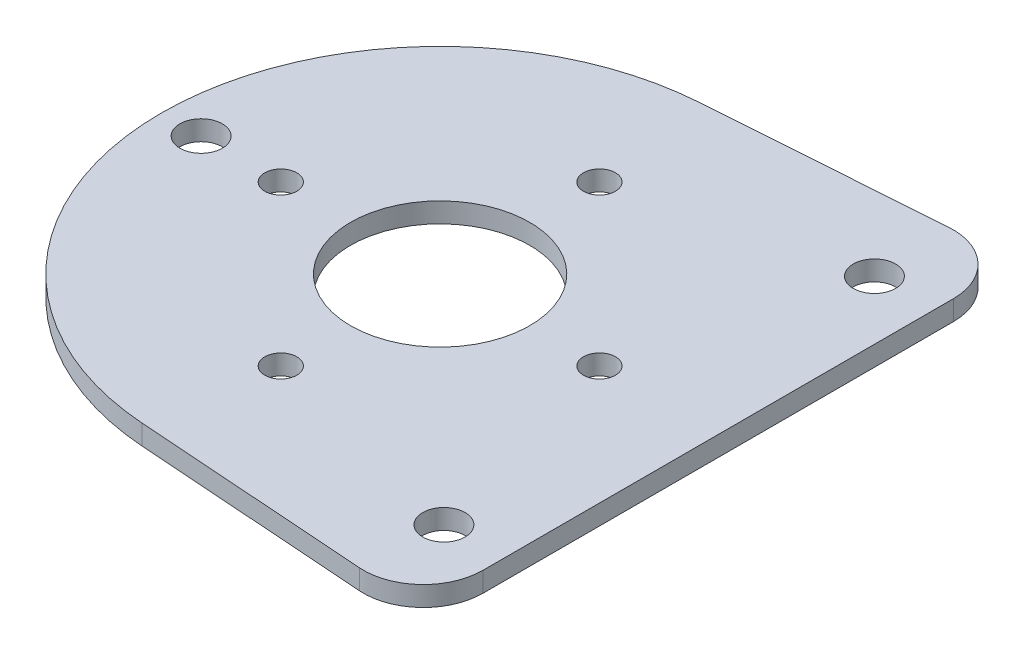
ISO-10303-21;
HEADER;
FILE_DESCRIPTION(('STEP AP214'),'2;1');
FILE_NAME('part.step','',(''),(''),'','','');
FILE_SCHEMA(('AUTOMOTIVE_DESIGN { 1 0 10303 214 1 1 1 1 }'));
ENDSEC;
DATA;
#1=APPLICATION_CONTEXT('core data for automotive mechanical design processes');
#2=APPLICATION_PROTOCOL_DEFINITION('international standard','automotive_design',2000,#1);
#3=PRODUCT_CONTEXT('',#1,'mechanical');
#4=PRODUCT('Part','Part','',(#3));
#5=PRODUCT_RELATED_PRODUCT_CATEGORY('part','',(#4));
#6=PRODUCT_DEFINITION_FORMATION('','',#4);
#7=PRODUCT_DEFINITION_CONTEXT('part definition',#1,'design');
#8=PRODUCT_DEFINITION('design','',#6,#7);
#9=PRODUCT_DEFINITION_SHAPE('','',#8);
#10=(LENGTH_UNIT() NAMED_UNIT(*) SI_UNIT(.MILLI.,.METRE.));
#11=(NAMED_UNIT(*) PLANE_ANGLE_UNIT() SI_UNIT($,.RADIAN.));
#12=(NAMED_UNIT(*) SI_UNIT($,.STERADIAN.) SOLID_ANGLE_UNIT());
#13=UNCERTAINTY_MEASURE_WITH_UNIT(LENGTH_MEASURE(1.E-05),#10,'distance_accuracy_value','');
#14=(GEOMETRIC_REPRESENTATION_CONTEXT(3) GLOBAL_UNCERTAINTY_ASSIGNED_CONTEXT((#13)) GLOBAL_UNIT_ASSIGNED_CONTEXT((#10,
#11,#12)) REPRESENTATION_CONTEXT('',''));
#15=CARTESIAN_POINT('',(0.,0.,0.));
#16=DIRECTION('',(0.,0.,1.));
#17=DIRECTION('',(1.,0.,0.));
#18=AXIS2_PLACEMENT_3D('',#15,#16,#17);
#19=CARTESIAN_POINT('',(89.48928,0.,0.));
#20=DIRECTION('',(0.,-1.,0.));
#21=DIRECTION('',(0.,0.,-1.));
#22=AXIS2_PLACEMENT_3D('',#19,#20,#21);
#23=PLANE('',#22);
#24=DIRECTION('',(-0.997479288528233,0.,0.0709582198001818));
#25=VECTOR('',#24,1.);
#26=CARTESIAN_POINT('',(85.8846024341508,0.,-50.6719478572342));
#27=LINE('',#26,#25);
#28=CARTESIAN_POINT('',(34.1221229564032,0.,-46.9896925578747));
#29=VERTEX_POINT('',#28);
#30=CARTESIAN_POINT('',(-3.15409287011808,0.,-44.3379543750799));
#31=VERTEX_POINT('',#30);
#32=EDGE_CURVE('E104',#29,#31,#27,.T.);
#33=ORIENTED_EDGE('',*,*,#32,.F.);
#34=CARTESIAN_POINT('',(34.798,0.,-37.4887023346433));
#35=DIRECTION('',(0.,-1.,0.));
#36=DIRECTION('',(0.,0.,-1.));
#37=AXIS2_PLACEMENT_3D('',#34,#35,#36);
#38=CIRCLE('',#37,9.525);
#39=CARTESIAN_POINT('',(44.323,0.,-37.4887023346433));
#40=VERTEX_POINT('',#39);
#41=EDGE_CURVE('E43',#29,#40,#38,.T.);
#42=ORIENTED_EDGE('',*,*,#41,.T.);
#43=DIRECTION('',(0.,0.,1.));
#44=VECTOR('',#43,1.);
#45=CARTESIAN_POINT('',(44.323,0.,47.7153578260551));
#46=LINE('',#45,#44);
#47=CARTESIAN_POINT('',(44.323,0.,37.4887023346433));
#48=VERTEX_POINT('',#47);
#49=EDGE_CURVE('E135',#40,#48,#46,.T.);
#50=ORIENTED_EDGE('',*,*,#49,.T.);
#51=CARTESIAN_POINT('',(34.798,0.,37.4887023346433));
#52=DIRECTION('',(0.,-1.,0.));
#53=DIRECTION('',(0.,0.,-1.));
#54=AXIS2_PLACEMENT_3D('',#51,#52,#53);
#55=CIRCLE('',#54,9.525);
#56=CARTESIAN_POINT('',(34.1221229564032,0.,46.9896925578747));
#57=VERTEX_POINT('',#56);
#58=EDGE_CURVE('E50',#48,#57,#55,.T.);
#59=ORIENTED_EDGE('',*,*,#58,.T.);
#60=DIRECTION('',(0.997479288528233,0.,0.0709582198001818));
#61=VECTOR('',#60,1.);
#62=CARTESIAN_POINT('',(85.8846024341508,0.,50.6719478572342));
#63=LINE('',#62,#61);
#64=CARTESIAN_POINT('',(-3.15409287011808,0.,44.3379543750799));
#65=VERTEX_POINT('',#64);
#66=EDGE_CURVE('E99',#65,#57,#63,.T.);
#67=ORIENTED_EDGE('',*,*,#66,.F.);
#68=CARTESIAN_POINT('',(0.,0.,0.));
#69=DIRECTION('',(0.,1.,0.));
#70=DIRECTION('',(0.,0.,1.));
#71=AXIS2_PLACEMENT_3D('',#68,#69,#70);
#72=CIRCLE('',#71,44.45);
#73=EDGE_CURVE('E119',#31,#65,#72,.T.);
#74=ORIENTED_EDGE('',*,*,#73,.F.);
#75=EDGE_LOOP('',(#33,#42,#50,#59,#67,#74));
#76=FACE_BOUND('',#75,.T.);
#77=CARTESIAN_POINT('',(0.,0.,0.));
#78=DIRECTION('',(0.,1.,0.));
#79=DIRECTION('',(0.,0.,1.));
#80=AXIS2_PLACEMENT_3D('',#77,#78,#79);
#81=CIRCLE('',#80,14.28115);
#82=CARTESIAN_POINT('',(0.,0.,14.28115));
#83=VERTEX_POINT('',#82);
#84=EDGE_CURVE('E338',#83,#83,#81,.T.);
#85=ORIENTED_EDGE('',*,*,#84,.T.);
#86=EDGE_LOOP('',(#85));
#87=FACE_BOUND('',#86,.T.);
#88=CARTESIAN_POINT('',(-25.4,0.,0.));
#89=DIRECTION('',(0.,1.,0.));
#90=DIRECTION('',(0.,0.,1.));
#91=AXIS2_PLACEMENT_3D('',#88,#89,#90);
#92=CIRCLE('',#91,2.5527);
#93=CARTESIAN_POINT('',(-25.4,0.,2.5527));
#94=VERTEX_POINT('',#93);
#95=EDGE_CURVE('E335',#94,#94,#92,.T.);
#96=ORIENTED_EDGE('',*,*,#95,.T.);
#97=EDGE_LOOP('',(#96));
#98=FACE_BOUND('',#97,.T.);
#99=CARTESIAN_POINT('',(0.,0.,25.4));
#100=DIRECTION('',(0.,1.,0.));
#101=DIRECTION('',(0.,0.,1.));
#102=AXIS2_PLACEMENT_3D('',#99,#100,#101);
#103=CIRCLE('',#102,2.5527);
#104=CARTESIAN_POINT('',(0.,0.,27.9527));
#105=VERTEX_POINT('',#104);
#106=EDGE_CURVE('E329',#105,#105,#103,.T.);
#107=ORIENTED_EDGE('',*,*,#106,.T.);
#108=EDGE_LOOP('',(#107));
#109=FACE_BOUND('',#108,.T.);
#110=CARTESIAN_POINT('',(25.4,0.,0.));
#111=DIRECTION('',(0.,1.,0.));
#112=DIRECTION('',(0.,0.,1.));
#113=AXIS2_PLACEMENT_3D('',#110,#111,#112);
#114=CIRCLE('',#113,2.5527);
#115=CARTESIAN_POINT('',(25.4,0.,2.5527));
#116=VERTEX_POINT('',#115);
#117=EDGE_CURVE('E323',#116,#116,#114,.T.);
#118=ORIENTED_EDGE('',*,*,#117,.T.);
#119=EDGE_LOOP('',(#118));
#120=FACE_BOUND('',#119,.T.);
#121=CARTESIAN_POINT('',(0.,0.,-25.4));
#122=DIRECTION('',(0.,1.,0.));
#123=DIRECTION('',(0.,0.,1.));
#124=AXIS2_PLACEMENT_3D('',#121,#122,#123);
#125=CIRCLE('',#124,2.5527);
#126=CARTESIAN_POINT('',(0.,0.,-22.8473));
#127=VERTEX_POINT('',#126);
#128=EDGE_CURVE('E317',#127,#127,#125,.T.);
#129=ORIENTED_EDGE('',*,*,#128,.T.);
#130=EDGE_LOOP('',(#129));
#131=FACE_BOUND('',#130,.T.);
#132=CARTESIAN_POINT('',(34.925,0.,34.3147133180326));
#133=DIRECTION('',(0.,1.,0.));
#134=DIRECTION('',(0.,0.,1.));
#135=AXIS2_PLACEMENT_3D('',#132,#133,#134);
#136=CIRCLE('',#135,3.3782);
#137=CARTESIAN_POINT('',(34.925,0.,37.6929133180326));
#138=VERTEX_POINT('',#137);
#139=EDGE_CURVE('E311',#138,#138,#136,.T.);
#140=ORIENTED_EDGE('',*,*,#139,.T.);
#141=EDGE_LOOP('',(#140));
#142=FACE_BOUND('',#141,.T.);
#143=CARTESIAN_POINT('',(34.925,0.,-34.3147133180325));
#144=DIRECTION('',(0.,1.,0.));
#145=DIRECTION('',(0.,0.,1.));
#146=AXIS2_PLACEMENT_3D('',#143,#144,#145);
#147=CIRCLE('',#146,3.3782);
#148=CARTESIAN_POINT('',(34.925,0.,-30.9365133180325));
#149=VERTEX_POINT('',#148);
#150=EDGE_CURVE('E305',#149,#149,#147,.T.);
#151=ORIENTED_EDGE('',*,*,#150,.T.);
#152=EDGE_LOOP('',(#151));
#153=FACE_BOUND('',#152,.T.);
#154=CARTESIAN_POINT('',(-38.1,0.,0.));
#155=DIRECTION('',(0.,1.,0.));
#156=DIRECTION('',(0.,0.,1.));
#157=AXIS2_PLACEMENT_3D('',#154,#155,#156);
#158=CIRCLE('',#157,3.3782);
#159=CARTESIAN_POINT('',(-38.1,0.,3.37820000000002));
#160=VERTEX_POINT('',#159);
#161=EDGE_CURVE('E295',#160,#160,#158,.T.);
#162=ORIENTED_EDGE('',*,*,#161,.T.);
#163=EDGE_LOOP('',(#162));
#164=FACE_BOUND('',#163,.T.);
#165=ADVANCED_FACE('F35',(#76,#87,#98,#109,#120,#131,#142,#153,#164),#23,.T.);
#166=CARTESIAN_POINT('',(89.48928,3.175,0.));
#167=DIRECTION('',(0.,-1.,0.));
#168=DIRECTION('',(0.,0.,-1.));
#169=AXIS2_PLACEMENT_3D('',#166,#167,#168);
#170=PLANE('',#169);
#171=CARTESIAN_POINT('',(-38.1,3.175,0.));
#172=DIRECTION('',(0.,1.,0.));
#173=DIRECTION('',(0.,0.,1.));
#174=AXIS2_PLACEMENT_3D('',#171,#172,#173);
#175=CIRCLE('',#174,3.3782);
#176=CARTESIAN_POINT('',(-38.1,3.175,3.37820000000002));
#177=VERTEX_POINT('',#176);
#178=EDGE_CURVE('E142',#177,#177,#175,.T.);
#179=ORIENTED_EDGE('',*,*,#178,.F.);
#180=EDGE_LOOP('',(#179));
#181=FACE_BOUND('',#180,.T.);
#182=CARTESIAN_POINT('',(34.925,3.175,-34.3147133180325));
#183=DIRECTION('',(0.,1.,0.));
#184=DIRECTION('',(0.,0.,1.));
#185=AXIS2_PLACEMENT_3D('',#182,#183,#184);
#186=CIRCLE('',#185,3.3782);
#187=CARTESIAN_POINT('',(34.925,3.175,-30.9365133180325));
#188=VERTEX_POINT('',#187);
#189=EDGE_CURVE('E299',#188,#188,#186,.T.);
#190=ORIENTED_EDGE('',*,*,#189,.F.);
#191=EDGE_LOOP('',(#190));
#192=FACE_BOUND('',#191,.T.);
#193=CARTESIAN_POINT('',(34.925,3.175,34.3147133180326));
#194=DIRECTION('',(0.,1.,0.));
#195=DIRECTION('',(0.,0.,1.));
#196=AXIS2_PLACEMENT_3D('',#193,#194,#195);
#197=CIRCLE('',#196,3.3782);
#198=CARTESIAN_POINT('',(34.925,3.175,37.6929133180326));
#199=VERTEX_POINT('',#198);
#200=EDGE_CURVE('E308',#199,#199,#197,.T.);
#201=ORIENTED_EDGE('',*,*,#200,.F.);
#202=EDGE_LOOP('',(#201));
#203=FACE_BOUND('',#202,.T.);
#204=CARTESIAN_POINT('',(0.,3.175,-25.4));
#205=DIRECTION('',(0.,1.,0.));
#206=DIRECTION('',(0.,0.,1.));
#207=AXIS2_PLACEMENT_3D('',#204,#205,#206);
#208=CIRCLE('',#207,2.5527);
#209=CARTESIAN_POINT('',(0.,3.175,-22.8473));
#210=VERTEX_POINT('',#209);
#211=EDGE_CURVE('E314',#210,#210,#208,.T.);
#212=ORIENTED_EDGE('',*,*,#211,.F.);
#213=EDGE_LOOP('',(#212));
#214=FACE_BOUND('',#213,.T.);
#215=CARTESIAN_POINT('',(25.4,3.175,0.));
#216=DIRECTION('',(0.,1.,0.));
#217=DIRECTION('',(0.,0.,1.));
#218=AXIS2_PLACEMENT_3D('',#215,#216,#217);
#219=CIRCLE('',#218,2.5527);
#220=CARTESIAN_POINT('',(25.4,3.175,2.55270000000001));
#221=VERTEX_POINT('',#220);
#222=EDGE_CURVE('E320',#221,#221,#219,.T.);
#223=ORIENTED_EDGE('',*,*,#222,.F.);
#224=EDGE_LOOP('',(#223));
#225=FACE_BOUND('',#224,.T.);
#226=CARTESIAN_POINT('',(0.,3.175,25.4));
#227=DIRECTION('',(0.,1.,0.));
#228=DIRECTION('',(0.,0.,1.));
#229=AXIS2_PLACEMENT_3D('',#226,#227,#228);
#230=CIRCLE('',#229,2.5527);
#231=CARTESIAN_POINT('',(0.,3.175,27.9527));
#232=VERTEX_POINT('',#231);
#233=EDGE_CURVE('E326',#232,#232,#230,.T.);
#234=ORIENTED_EDGE('',*,*,#233,.F.);
#235=EDGE_LOOP('',(#234));
#236=FACE_BOUND('',#235,.T.);
#237=CARTESIAN_POINT('',(-25.4,3.175,0.));
#238=DIRECTION('',(0.,1.,0.));
#239=DIRECTION('',(0.,0.,1.));
#240=AXIS2_PLACEMENT_3D('',#237,#238,#239);
#241=CIRCLE('',#240,2.5527);
#242=CARTESIAN_POINT('',(-25.4,3.175,2.55270000000001));
#243=VERTEX_POINT('',#242);
#244=EDGE_CURVE('E332',#243,#243,#241,.T.);
#245=ORIENTED_EDGE('',*,*,#244,.F.);
#246=EDGE_LOOP('',(#245));
#247=FACE_BOUND('',#246,.T.);
#248=DIRECTION('',(0.,0.,1.));
#249=VECTOR('',#248,1.);
#250=CARTESIAN_POINT('',(44.323,3.175,47.7153578260551));
#251=LINE('',#250,#249);
#252=CARTESIAN_POINT('',(44.323,3.175,-37.4887023346433));
#253=VERTEX_POINT('',#252);
#254=CARTESIAN_POINT('',(44.323,3.175,37.4887023346433));
#255=VERTEX_POINT('',#254);
#256=EDGE_CURVE('E143',#253,#255,#251,.T.);
#257=ORIENTED_EDGE('',*,*,#256,.F.);
#258=CARTESIAN_POINT('',(34.798,3.175,-37.4887023346433));
#259=DIRECTION('',(0.,-1.,0.));
#260=DIRECTION('',(0.,0.,-1.));
#261=AXIS2_PLACEMENT_3D('',#258,#259,#260);
#262=CIRCLE('',#261,9.525);
#263=CARTESIAN_POINT('',(34.1221229564032,3.175,-46.9896925578747));
#264=VERTEX_POINT('',#263);
#265=EDGE_CURVE('E98',#253,#264,#262,.F.);
#266=ORIENTED_EDGE('',*,*,#265,.T.);
#267=DIRECTION('',(-0.997479288528233,0.,0.0709582198001818));
#268=VECTOR('',#267,1.);
#269=CARTESIAN_POINT('',(85.8846024341508,3.175,-50.6719478572342));
#270=LINE('',#269,#268);
#271=CARTESIAN_POINT('',(-3.15409287011808,3.175,-44.3379543750799));
#272=VERTEX_POINT('',#271);
#273=EDGE_CURVE('E89',#264,#272,#270,.T.);
#274=ORIENTED_EDGE('',*,*,#273,.T.);
#275=CARTESIAN_POINT('',(0.,3.175,0.));
#276=DIRECTION('',(0.,1.,0.));
#277=DIRECTION('',(0.,0.,1.));
#278=AXIS2_PLACEMENT_3D('',#275,#276,#277);
#279=CIRCLE('',#278,44.45);
#280=CARTESIAN_POINT('',(-3.15409287011808,3.175,44.3379543750799));
#281=VERTEX_POINT('',#280);
#282=EDGE_CURVE('E96',#272,#281,#279,.T.);
#283=ORIENTED_EDGE('',*,*,#282,.T.);
#284=DIRECTION('',(0.997479288528233,0.,0.0709582198001818));
#285=VECTOR('',#284,1.);
#286=CARTESIAN_POINT('',(85.8846024341508,3.175,50.6719478572342));
#287=LINE('',#286,#285);
#288=CARTESIAN_POINT('',(34.1221229564032,3.175,46.9896925578747));
#289=VERTEX_POINT('',#288);
#290=EDGE_CURVE('E113',#281,#289,#287,.T.);
#291=ORIENTED_EDGE('',*,*,#290,.T.);
#292=CARTESIAN_POINT('',(34.798,3.175,37.4887023346433));
#293=DIRECTION('',(0.,-1.,0.));
#294=DIRECTION('',(0.,0.,-1.));
#295=AXIS2_PLACEMENT_3D('',#292,#293,#294);
#296=CIRCLE('',#295,9.525);
#297=EDGE_CURVE('E128',#289,#255,#296,.F.);
#298=ORIENTED_EDGE('',*,*,#297,.T.);
#299=EDGE_LOOP('',(#257,#266,#274,#283,#291,#298));
#300=FACE_BOUND('',#299,.T.);
#301=CARTESIAN_POINT('',(0.,3.175,0.));
#302=DIRECTION('',(0.,1.,0.));
#303=DIRECTION('',(0.,0.,1.));
#304=AXIS2_PLACEMENT_3D('',#301,#302,#303);
#305=CIRCLE('',#304,14.28115);
#306=CARTESIAN_POINT('',(0.,3.175,14.28115));
#307=VERTEX_POINT('',#306);
#308=EDGE_CURVE('E120',#307,#307,#305,.T.);
#309=ORIENTED_EDGE('',*,*,#308,.F.);
#310=EDGE_LOOP('',(#309));
#311=FACE_BOUND('',#310,.T.);
#312=ADVANCED_FACE('F92',(#181,#192,#203,#214,#225,#236,#247,#300,#311),#170,.F.);
#313=CARTESIAN_POINT('',(85.8846024341508,3.175,-50.6719478572342));
#314=DIRECTION('',(0.0709582198001818,0.,0.997479288528233));
#315=DIRECTION('',(0.997479288528233,0.,-0.0709582198001818));
#316=AXIS2_PLACEMENT_3D('',#313,#314,#315);
#317=PLANE('',#316);
#318=ORIENTED_EDGE('',*,*,#273,.F.);
#319=DIRECTION('',(0.,1.,0.));
#320=VECTOR('',#319,1.);
#321=CARTESIAN_POINT('',(34.1221229564033,3.175,-46.9896925578747));
#322=LINE('',#321,#320);
#323=EDGE_CURVE('E58',#264,#29,#322,.F.);
#324=ORIENTED_EDGE('',*,*,#323,.T.);
#325=ORIENTED_EDGE('',*,*,#32,.T.);
#326=DIRECTION('',(0.,-1.,0.));
#327=VECTOR('',#326,1.);
#328=CARTESIAN_POINT('',(-3.15409287011808,3.175,-44.3379543750799));
#329=LINE('',#328,#327);
#330=EDGE_CURVE('E102',#272,#31,#329,.T.);
#331=ORIENTED_EDGE('',*,*,#330,.F.);
#332=EDGE_LOOP('',(#318,#324,#325,#331));
#333=FACE_BOUND('',#332,.T.);
#334=ADVANCED_FACE('F103',(#333),#317,.F.);
#335=CARTESIAN_POINT('',(0.,3.175,0.));
#336=DIRECTION('',(0.,-1.,0.));
#337=DIRECTION('',(0.,0.,-1.));
#338=AXIS2_PLACEMENT_3D('',#335,#336,#337);
#339=CYLINDRICAL_SURFACE('',#338,44.45);
#340=ORIENTED_EDGE('',*,*,#73,.T.);
#341=DIRECTION('',(0.,-1.,0.));
#342=VECTOR('',#341,1.);
#343=CARTESIAN_POINT('',(-3.15409287011808,3.175,44.3379543750799));
#344=LINE('',#343,#342);
#345=EDGE_CURVE('E108',#281,#65,#344,.T.);
#346=ORIENTED_EDGE('',*,*,#345,.F.);
#347=ORIENTED_EDGE('',*,*,#282,.F.);
#348=ORIENTED_EDGE('',*,*,#330,.T.);
#349=EDGE_LOOP('',(#340,#346,#347,#348));
#350=FACE_BOUND('',#349,.T.);
#351=ADVANCED_FACE('F110',(#350),#339,.T.);
#352=CARTESIAN_POINT('',(85.8846024341508,3.175,50.6719478572342));
#353=DIRECTION('',(0.0709582198001818,0.,-0.997479288528233));
#354=DIRECTION('',(-0.997479288528233,0.,-0.0709582198001818));
#355=AXIS2_PLACEMENT_3D('',#352,#353,#354);
#356=PLANE('',#355);
#357=ORIENTED_EDGE('',*,*,#66,.T.);
#358=DIRECTION('',(0.,1.,0.));
#359=VECTOR('',#358,1.);
#360=CARTESIAN_POINT('',(34.1221229564033,3.175,46.9896925578747));
#361=LINE('',#360,#359);
#362=EDGE_CURVE('E11',#57,#289,#361,.T.);
#363=ORIENTED_EDGE('',*,*,#362,.T.);
#364=ORIENTED_EDGE('',*,*,#290,.F.);
#365=ORIENTED_EDGE('',*,*,#345,.T.);
#366=EDGE_LOOP('',(#357,#363,#364,#365));
#367=FACE_BOUND('',#366,.T.);
#368=ADVANCED_FACE('F164',(#367),#356,.F.);
#369=CARTESIAN_POINT('',(0.,3.175,0.));
#370=DIRECTION('',(0.,-1.,0.));
#371=DIRECTION('',(0.,0.,-1.));
#372=AXIS2_PLACEMENT_3D('',#369,#370,#371);
#373=CYLINDRICAL_SURFACE('',#372,14.28115);
#374=ORIENTED_EDGE('',*,*,#308,.T.);
#375=EDGE_LOOP('',(#374));
#376=FACE_BOUND('',#375,.T.);
#377=ORIENTED_EDGE('',*,*,#84,.F.);
#378=EDGE_LOOP('',(#377));
#379=FACE_BOUND('',#378,.T.);
#380=ADVANCED_FACE('F167',(#376,#379),#373,.F.);
#381=CARTESIAN_POINT('',(-25.4,3.175,0.));
#382=DIRECTION('',(0.,1.,0.));
#383=DIRECTION('',(0.,0.,1.));
#384=AXIS2_PLACEMENT_3D('',#381,#382,#383);
#385=CYLINDRICAL_SURFACE('',#384,2.5527);
#386=ORIENTED_EDGE('',*,*,#95,.F.);
#387=EDGE_LOOP('',(#386));
#388=FACE_BOUND('',#387,.T.);
#389=ORIENTED_EDGE('',*,*,#244,.T.);
#390=EDGE_LOOP('',(#389));
#391=FACE_BOUND('',#390,.T.);
#392=ADVANCED_FACE('F190',(#388,#391),#385,.F.);
#393=CARTESIAN_POINT('',(0.,3.175,25.4));
#394=DIRECTION('',(0.,1.,0.));
#395=DIRECTION('',(0.,0.,1.));
#396=AXIS2_PLACEMENT_3D('',#393,#394,#395);
#397=CYLINDRICAL_SURFACE('',#396,2.5527);
#398=ORIENTED_EDGE('',*,*,#106,.F.);
#399=EDGE_LOOP('',(#398));
#400=FACE_BOUND('',#399,.T.);
#401=ORIENTED_EDGE('',*,*,#233,.T.);
#402=EDGE_LOOP('',(#401));
#403=FACE_BOUND('',#402,.T.);
#404=ADVANCED_FACE('F197',(#400,#403),#397,.F.);
#405=CARTESIAN_POINT('',(25.4,3.175,0.));
#406=DIRECTION('',(0.,1.,0.));
#407=DIRECTION('',(0.,0.,1.));
#408=AXIS2_PLACEMENT_3D('',#405,#406,#407);
#409=CYLINDRICAL_SURFACE('',#408,2.5527);
#410=ORIENTED_EDGE('',*,*,#117,.F.);
#411=EDGE_LOOP('',(#410));
#412=FACE_BOUND('',#411,.T.);
#413=ORIENTED_EDGE('',*,*,#222,.T.);
#414=EDGE_LOOP('',(#413));
#415=FACE_BOUND('',#414,.T.);
#416=ADVANCED_FACE('F205',(#412,#415),#409,.F.);
#417=CARTESIAN_POINT('',(0.,3.175,-25.4));
#418=DIRECTION('',(0.,1.,0.));
#419=DIRECTION('',(0.,0.,1.));
#420=AXIS2_PLACEMENT_3D('',#417,#418,#419);
#421=CYLINDRICAL_SURFACE('',#420,2.5527);
#422=ORIENTED_EDGE('',*,*,#128,.F.);
#423=EDGE_LOOP('',(#422));
#424=FACE_BOUND('',#423,.T.);
#425=ORIENTED_EDGE('',*,*,#211,.T.);
#426=EDGE_LOOP('',(#425));
#427=FACE_BOUND('',#426,.T.);
#428=ADVANCED_FACE('F213',(#424,#427),#421,.F.);
#429=CARTESIAN_POINT('',(34.925,3.175,34.3147133180326));
#430=DIRECTION('',(0.,1.,0.));
#431=DIRECTION('',(0.,0.,1.));
#432=AXIS2_PLACEMENT_3D('',#429,#430,#431);
#433=CYLINDRICAL_SURFACE('',#432,3.3782);
#434=ORIENTED_EDGE('',*,*,#139,.F.);
#435=EDGE_LOOP('',(#434));
#436=FACE_BOUND('',#435,.T.);
#437=ORIENTED_EDGE('',*,*,#200,.T.);
#438=EDGE_LOOP('',(#437));
#439=FACE_BOUND('',#438,.T.);
#440=ADVANCED_FACE('F221',(#436,#439),#433,.F.);
#441=CARTESIAN_POINT('',(34.925,3.175,-34.3147133180325));
#442=DIRECTION('',(0.,1.,0.));
#443=DIRECTION('',(0.,0.,1.));
#444=AXIS2_PLACEMENT_3D('',#441,#442,#443);
#445=CYLINDRICAL_SURFACE('',#444,3.3782);
#446=ORIENTED_EDGE('',*,*,#150,.F.);
#447=EDGE_LOOP('',(#446));
#448=FACE_BOUND('',#447,.T.);
#449=ORIENTED_EDGE('',*,*,#189,.T.);
#450=EDGE_LOOP('',(#449));
#451=FACE_BOUND('',#450,.T.);
#452=ADVANCED_FACE('F229',(#448,#451),#445,.F.);
#453=CARTESIAN_POINT('',(-38.1,3.175,0.));
#454=DIRECTION('',(0.,1.,0.));
#455=DIRECTION('',(0.,0.,1.));
#456=AXIS2_PLACEMENT_3D('',#453,#454,#455);
#457=CYLINDRICAL_SURFACE('',#456,3.3782);
#458=ORIENTED_EDGE('',*,*,#161,.F.);
#459=EDGE_LOOP('',(#458));
#460=FACE_BOUND('',#459,.T.);
#461=ORIENTED_EDGE('',*,*,#178,.T.);
#462=EDGE_LOOP('',(#461));
#463=FACE_BOUND('',#462,.T.);
#464=ADVANCED_FACE('F152',(#460,#463),#457,.F.);
#465=CARTESIAN_POINT('',(44.323,0.,47.7153578260551));
#466=DIRECTION('',(-1.,0.,0.));
#467=DIRECTION('',(0.,0.,1.));
#468=AXIS2_PLACEMENT_3D('',#465,#466,#467);
#469=PLANE('',#468);
#470=ORIENTED_EDGE('',*,*,#49,.F.);
#471=DIRECTION('',(0.,1.,0.));
#472=VECTOR('',#471,1.);
#473=CARTESIAN_POINT('',(44.323,0.,-37.4887023346433));
#474=LINE('',#473,#472);
#475=EDGE_CURVE('E125',#40,#253,#474,.T.);
#476=ORIENTED_EDGE('',*,*,#475,.T.);
#477=ORIENTED_EDGE('',*,*,#256,.T.);
#478=DIRECTION('',(0.,1.,0.));
#479=VECTOR('',#478,1.);
#480=CARTESIAN_POINT('',(44.323,0.,37.4887023346433));
#481=LINE('',#480,#479);
#482=EDGE_CURVE('E107',#255,#48,#481,.F.);
#483=ORIENTED_EDGE('',*,*,#482,.T.);
#484=EDGE_LOOP('',(#470,#476,#477,#483));
#485=FACE_BOUND('',#484,.T.);
#486=ADVANCED_FACE('F139',(#485),#469,.F.);
#487=CARTESIAN_POINT('',(34.798,0.,-37.4887023346433));
#488=DIRECTION('',(0.,1.,0.));
#489=DIRECTION('',(0.,0.,1.));
#490=AXIS2_PLACEMENT_3D('',#487,#488,#489);
#491=CYLINDRICAL_SURFACE('',#490,9.525);
#492=ORIENTED_EDGE('',*,*,#41,.F.);
#493=ORIENTED_EDGE('',*,*,#323,.F.);
#494=ORIENTED_EDGE('',*,*,#265,.F.);
#495=ORIENTED_EDGE('',*,*,#475,.F.);
#496=EDGE_LOOP('',(#492,#493,#494,#495));
#497=FACE_BOUND('',#496,.T.);
#498=ADVANCED_FACE('F145',(#497),#491,.T.);
#499=CARTESIAN_POINT('',(34.798,3.175,37.4887023346433));
#500=DIRECTION('',(0.,1.,0.));
#501=DIRECTION('',(0.,0.,1.));
#502=AXIS2_PLACEMENT_3D('',#499,#500,#501);
#503=CYLINDRICAL_SURFACE('',#502,9.525);
#504=ORIENTED_EDGE('',*,*,#58,.F.);
#505=ORIENTED_EDGE('',*,*,#482,.F.);
#506=ORIENTED_EDGE('',*,*,#297,.F.);
#507=ORIENTED_EDGE('',*,*,#362,.F.);
#508=EDGE_LOOP('',(#504,#505,#506,#507));
#509=FACE_BOUND('',#508,.T.);
#510=ADVANCED_FACE('F37',(#509),#503,.T.);
#511=CLOSED_SHELL('',(#165,#312,#334,#351,#368,#380,#392,#404,#416,#428,#440,#452,#464,#486,
#498,#510));
#512=MANIFOLD_SOLID_BREP('B2',#511);
#513=ADVANCED_BREP_SHAPE_REPRESENTATION('',(#18,#512),#14);
#514=SHAPE_DEFINITION_REPRESENTATION(#9,#513);
ENDSEC;
END-ISO-10303-21;
